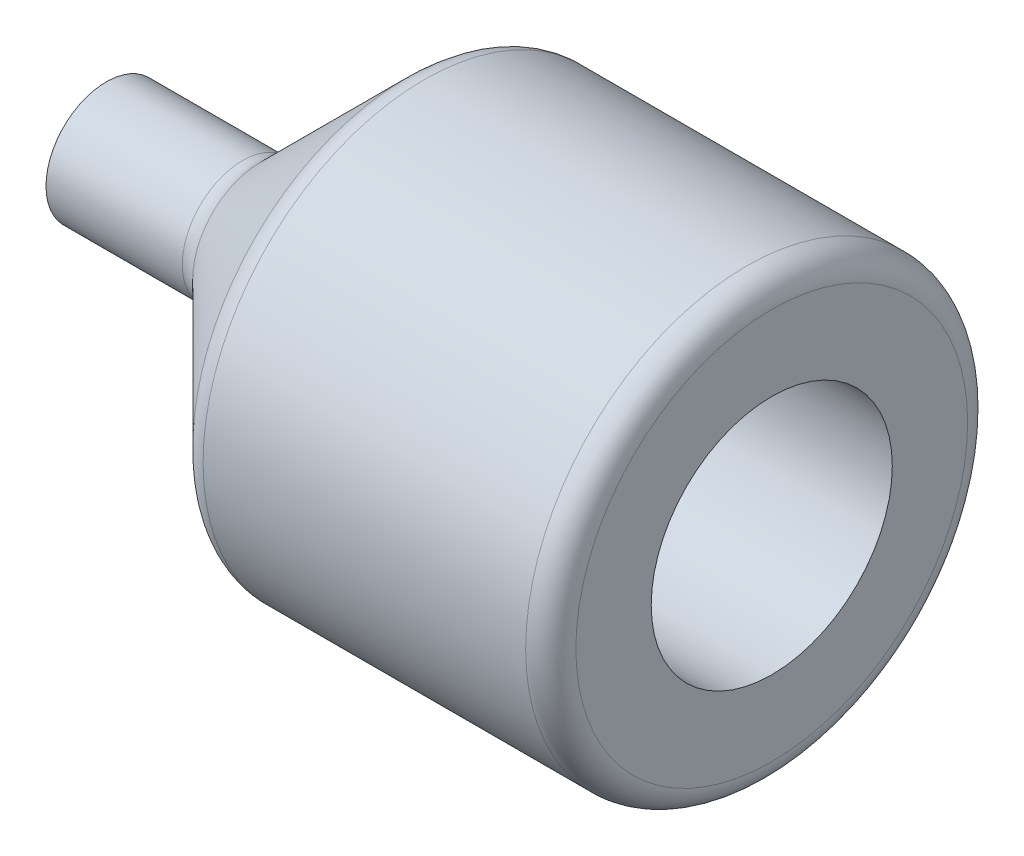
ISO-10303-21;
HEADER;
FILE_DESCRIPTION(('STEP AP214'),'2;1');
FILE_NAME('part.step','',(''),(''),'','','');
FILE_SCHEMA(('AUTOMOTIVE_DESIGN { 1 0 10303 214 1 1 1 1 }'));
ENDSEC;
DATA;
#1=APPLICATION_CONTEXT('core data for automotive mechanical design processes');
#2=APPLICATION_PROTOCOL_DEFINITION('international standard','automotive_design',2000,#1);
#3=PRODUCT_CONTEXT('',#1,'mechanical');
#4=PRODUCT('Part','Part','',(#3));
#5=PRODUCT_RELATED_PRODUCT_CATEGORY('part','',(#4));
#6=PRODUCT_DEFINITION_FORMATION('','',#4);
#7=PRODUCT_DEFINITION_CONTEXT('part definition',#1,'design');
#8=PRODUCT_DEFINITION('design','',#6,#7);
#9=PRODUCT_DEFINITION_SHAPE('','',#8);
#10=(LENGTH_UNIT() NAMED_UNIT(*) SI_UNIT(.MILLI.,.METRE.));
#11=(NAMED_UNIT(*) PLANE_ANGLE_UNIT() SI_UNIT($,.RADIAN.));
#12=(NAMED_UNIT(*) SI_UNIT($,.STERADIAN.) SOLID_ANGLE_UNIT());
#13=UNCERTAINTY_MEASURE_WITH_UNIT(LENGTH_MEASURE(1.E-05),#10,'distance_accuracy_value','');
#14=(GEOMETRIC_REPRESENTATION_CONTEXT(3) GLOBAL_UNCERTAINTY_ASSIGNED_CONTEXT((#13)) GLOBAL_UNIT_ASSIGNED_CONTEXT((#10,
#11,#12)) REPRESENTATION_CONTEXT('',''));
#15=CARTESIAN_POINT('',(0.,0.,0.));
#16=DIRECTION('',(0.,0.,1.));
#17=DIRECTION('',(1.,0.,0.));
#18=AXIS2_PLACEMENT_3D('',#15,#16,#17);
#19=CARTESIAN_POINT('',(-96.0720000000002,102.821,84.2789999999996));
#20=DIRECTION('',(-1.,0.,0.));
#21=DIRECTION('',(0.,0.,1.));
#22=AXIS2_PLACEMENT_3D('',#19,#20,#21);
#23=CYLINDRICAL_SURFACE('',#22,2.3999999999996);
#24=CARTESIAN_POINT('',(-109.644792206136,102.821,84.2789999999996));
#25=DIRECTION('',(-1.,0.,0.));
#26=DIRECTION('',(0.,0.,1.));
#27=AXIS2_PLACEMENT_3D('',#24,#25,#26);
#28=CIRCLE('',#27,2.3999999999996);
#29=CARTESIAN_POINT('',(-109.644792206136,102.821,86.6789999999992));
#30=VERTEX_POINT('',#29);
#31=EDGE_CURVE('E59',#30,#30,#28,.T.);
#32=ORIENTED_EDGE('',*,*,#31,.T.);
#33=EDGE_LOOP('',(#32));
#34=FACE_BOUND('',#33,.T.);
#35=CARTESIAN_POINT('',(-115.072,102.821,84.2789999999996));
#36=DIRECTION('',(-1.,0.,0.));
#37=DIRECTION('',(0.,0.,1.));
#38=AXIS2_PLACEMENT_3D('',#35,#36,#37);
#39=CIRCLE('',#38,2.3999999999996);
#40=CARTESIAN_POINT('',(-115.072,102.821,86.6789999999992));
#41=VERTEX_POINT('',#40);
#42=EDGE_CURVE('E55',#41,#41,#39,.T.);
#43=ORIENTED_EDGE('',*,*,#42,.F.);
#44=EDGE_LOOP('',(#43));
#45=FACE_BOUND('',#44,.T.);
#46=ADVANCED_FACE('F35',(#34,#45),#23,.T.);
#47=CARTESIAN_POINT('',(-115.072,0.,84.279));
#48=DIRECTION('',(-1.,0.,0.));
#49=DIRECTION('',(0.,0.,1.));
#50=AXIS2_PLACEMENT_3D('',#47,#48,#49);
#51=PLANE('',#50);
#52=ORIENTED_EDGE('',*,*,#42,.T.);
#53=EDGE_LOOP('',(#52));
#54=FACE_BOUND('',#53,.T.);
#55=ADVANCED_FACE('F49',(#54),#51,.T.);
#56=CARTESIAN_POINT('',(-96.2719999999958,102.821,84.2789999999996));
#57=DIRECTION('',(1.,0.,0.));
#58=DIRECTION('',(0.,0.,-1.));
#59=AXIS2_PLACEMENT_3D('',#56,#57,#58);
#60=CONICAL_SURFACE('',#59,4.79999999999961,0.785398163396911);
#61=CARTESIAN_POINT('',(-101.072,102.821,84.279));
#62=VERTEX_POINT('',#61);
#63=VERTEX_LOOP('',#62);
#64=FACE_BOUND('',#63,.T.);
#65=CARTESIAN_POINT('',(-96.2719999999958,102.821,84.2789999999996));
#66=DIRECTION('',(-1.,0.,0.));
#67=DIRECTION('',(0.,0.,1.));
#68=AXIS2_PLACEMENT_3D('',#65,#66,#67);
#69=CIRCLE('',#68,4.79999999999961);
#70=CARTESIAN_POINT('',(-96.2719999999958,102.821,89.0789999999993));
#71=VERTEX_POINT('',#70);
#72=EDGE_CURVE('E53',#71,#71,#69,.T.);
#73=ORIENTED_EDGE('',*,*,#72,.F.);
#74=EDGE_LOOP('',(#73));
#75=FACE_BOUND('',#74,.T.);
#76=ADVANCED_FACE('F45',(#64,#75),#60,.F.);
#77=CARTESIAN_POINT('',(-96.0720000000002,102.821,84.2789999999996));
#78=DIRECTION('',(-1.,0.,0.));
#79=DIRECTION('',(0.,0.,1.));
#80=AXIS2_PLACEMENT_3D('',#77,#78,#79);
#81=CYLINDRICAL_SURFACE('',#80,4.79999999999962);
#82=ORIENTED_EDGE('',*,*,#72,.T.);
#83=EDGE_LOOP('',(#82));
#84=FACE_BOUND('',#83,.T.);
#85=CARTESIAN_POINT('',(-88.572,102.821,84.2789999999996));
#86=DIRECTION('',(-1.,0.,0.));
#87=DIRECTION('',(0.,0.,1.));
#88=AXIS2_PLACEMENT_3D('',#85,#86,#87);
#89=CIRCLE('',#88,4.79999999999962);
#90=CARTESIAN_POINT('',(-88.572,102.821,89.0789999999993));
#91=VERTEX_POINT('',#90);
#92=EDGE_CURVE('E56',#91,#91,#89,.T.);
#93=ORIENTED_EDGE('',*,*,#92,.F.);
#94=EDGE_LOOP('',(#93));
#95=FACE_BOUND('',#94,.T.);
#96=ADVANCED_FACE('F48',(#84,#95),#81,.F.);
#97=CARTESIAN_POINT('',(-88.572,0.,84.279));
#98=DIRECTION('',(1.,0.,0.));
#99=DIRECTION('',(0.,0.,-1.));
#100=AXIS2_PLACEMENT_3D('',#97,#98,#99);
#101=PLANE('',#100);
#102=CARTESIAN_POINT('',(-88.572,102.821,84.2789999999996));
#103=DIRECTION('',(1.,0.,0.));
#104=DIRECTION('',(0.,0.,-1.));
#105=AXIS2_PLACEMENT_3D('',#102,#103,#104);
#106=CIRCLE('',#105,7.79999999999961);
#107=CARTESIAN_POINT('',(-88.572,102.821,76.479));
#108=VERTEX_POINT('',#107);
#109=EDGE_CURVE('E11',#108,#108,#106,.T.);
#110=ORIENTED_EDGE('',*,*,#109,.T.);
#111=EDGE_LOOP('',(#110));
#112=FACE_BOUND('',#111,.T.);
#113=ORIENTED_EDGE('',*,*,#92,.T.);
#114=EDGE_LOOP('',(#113));
#115=FACE_BOUND('',#114,.T.);
#116=ADVANCED_FACE('F105',(#112,#115),#101,.T.);
#117=CARTESIAN_POINT('',(-96.0720000000002,102.821,84.2789999999996));
#118=DIRECTION('',(-1.,0.,0.));
#119=DIRECTION('',(0.,0.,1.));
#120=AXIS2_PLACEMENT_3D('',#117,#118,#119);
#121=CYLINDRICAL_SURFACE('',#120,8.79999999999961);
#122=CARTESIAN_POINT('',(-89.572,102.821,84.2789999999996));
#123=DIRECTION('',(1.,0.,0.));
#124=DIRECTION('',(0.,0.,-1.));
#125=AXIS2_PLACEMENT_3D('',#122,#123,#124);
#126=CIRCLE('',#125,8.79999999999961);
#127=CARTESIAN_POINT('',(-89.572,102.821,75.479));
#128=VERTEX_POINT('',#127);
#129=EDGE_CURVE('E42',#128,#128,#126,.F.);
#130=ORIENTED_EDGE('',*,*,#129,.T.);
#131=EDGE_LOOP('',(#130));
#132=FACE_BOUND('',#131,.T.);
#133=CARTESIAN_POINT('',(-102.416365081384,102.821,84.2789999999996));
#134=DIRECTION('',(1.,0.,0.));
#135=DIRECTION('',(0.,0.,-1.));
#136=AXIS2_PLACEMENT_3D('',#133,#134,#135);
#137=CIRCLE('',#136,8.79999999999961);
#138=CARTESIAN_POINT('',(-102.416365081384,102.821,75.479));
#139=VERTEX_POINT('',#138);
#140=EDGE_CURVE('E72',#139,#139,#137,.T.);
#141=ORIENTED_EDGE('',*,*,#140,.T.);
#142=EDGE_LOOP('',(#141));
#143=FACE_BOUND('',#142,.T.);
#144=ADVANCED_FACE('F77',(#132,#143),#121,.T.);
#145=CARTESIAN_POINT('',(-109.230578643763,102.821,84.2789999999996));
#146=DIRECTION('',(1.,0.,0.));
#147=DIRECTION('',(0.,0.,-1.));
#148=AXIS2_PLACEMENT_3D('',#145,#146,#147);
#149=CONICAL_SURFACE('',#148,2.3999999999996,0.785398163397004);
#150=CARTESIAN_POINT('',(-108.937685424949,102.821,84.2789999999996));
#151=DIRECTION('',(1.,0.,0.));
#152=DIRECTION('',(0.,0.,-1.));
#153=AXIS2_PLACEMENT_3D('',#150,#151,#152);
#154=CIRCLE('',#153,2.69289321881273);
#155=CARTESIAN_POINT('',(-108.937685424949,102.821,81.5861067811869));
#156=VERTEX_POINT('',#155);
#157=EDGE_CURVE('E69',#156,#156,#154,.T.);
#158=CARTESIAN_POINT('',(-103.12347186257,102.821,84.2789999999996));
#159=DIRECTION('',(-1.,0.,0.));
#160=DIRECTION('',(0.,0.,1.));
#161=AXIS2_PLACEMENT_3D('',#158,#159,#160);
#162=CIRCLE('',#161,8.50710678118648);
#163=CARTESIAN_POINT('',(-103.12347186257,102.821,75.7718932188132));
#164=VERTEX_POINT('',#163);
#165=EDGE_CURVE('E66',#164,#164,#162,.T.);
#166=CARTESIAN_POINT('',(-108.937685424949,102.821,81.5861067811869));
#167=CARTESIAN_POINT('',(-108.877120700341,102.821,81.5255420565789));
#168=CARTESIAN_POINT('',(-108.816555975733,102.821,81.4649773319708));
#169=CARTESIAN_POINT('',(-108.695426526517,102.821,81.3438478827547));
#170=CARTESIAN_POINT('',(-108.634861801909,102.821,81.2832831581466));
#171=CARTESIAN_POINT('',(-108.513732352693,102.821,81.1621537089305));
#172=CARTESIAN_POINT('',(-108.453167628084,102.821,81.1015889843224));
#173=CARTESIAN_POINT('',(-108.332038178868,102.821,80.9804595351063));
#174=CARTESIAN_POINT('',(-108.27147345426,102.821,80.9198948104983));
#175=CARTESIAN_POINT('',(-108.150344005044,102.821,80.7987653612821));
#176=CARTESIAN_POINT('',(-108.089779280436,102.821,80.7382006366741));
#177=CARTESIAN_POINT('',(-107.96864983122,102.821,80.617071187458));
#178=CARTESIAN_POINT('',(-107.908085106611,102.821,80.5565064628499));
#179=CARTESIAN_POINT('',(-107.786955657395,102.821,80.4353770136338));
#180=CARTESIAN_POINT('',(-107.726390932787,102.821,80.3748122890257));
#181=CARTESIAN_POINT('',(-107.605261483571,102.821,80.2536828398096));
#182=CARTESIAN_POINT('',(-107.544696758963,102.821,80.1931181152015));
#183=CARTESIAN_POINT('',(-107.423567309747,102.821,80.0719886659854));
#184=CARTESIAN_POINT('',(-107.363002585138,102.821,80.0114239413774));
#185=CARTESIAN_POINT('',(-107.241873135922,102.821,79.8902944921612));
#186=CARTESIAN_POINT('',(-107.181308411314,102.821,79.8297297675532));
#187=CARTESIAN_POINT('',(-107.060178962098,102.821,79.7086003183371));
#188=CARTESIAN_POINT('',(-106.99961423749,102.821,79.648035593729));
#189=CARTESIAN_POINT('',(-106.878484788273,102.821,79.5269061445129));
#190=CARTESIAN_POINT('',(-106.817920063665,102.821,79.4663414199048));
#191=CARTESIAN_POINT('',(-106.696790614449,102.821,79.3452119706887));
#192=CARTESIAN_POINT('',(-106.636225889841,102.821,79.2846472460806));
#193=CARTESIAN_POINT('',(-106.515096440625,102.821,79.1635177968645));
#194=CARTESIAN_POINT('',(-106.454531716017,102.821,79.1029530722565));
#195=CARTESIAN_POINT('',(-106.3334022668,102.821,78.9818236230403));
#196=CARTESIAN_POINT('',(-106.272837542192,102.821,78.9212588984323));
#197=CARTESIAN_POINT('',(-106.151708092976,102.821,78.8001294492162));
#198=CARTESIAN_POINT('',(-106.091143368368,102.821,78.7395647246081));
#199=CARTESIAN_POINT('',(-105.970013919152,102.821,78.618435275392));
#200=CARTESIAN_POINT('',(-105.909449194544,102.821,78.5578705507839));
#201=CARTESIAN_POINT('',(-105.788319745327,102.821,78.4367411015678));
#202=CARTESIAN_POINT('',(-105.727755020719,102.821,78.3761763769597));
#203=CARTESIAN_POINT('',(-105.606625571503,102.821,78.2550469277436));
#204=CARTESIAN_POINT('',(-105.546060846895,102.821,78.1944822031356));
#205=CARTESIAN_POINT('',(-105.424931397679,102.821,78.0733527539194));
#206=CARTESIAN_POINT('',(-105.364366673071,102.821,78.0127880293114));
#207=CARTESIAN_POINT('',(-105.243237223854,102.821,77.8916585800953));
#208=CARTESIAN_POINT('',(-105.182672499246,102.821,77.8310938554872));
#209=CARTESIAN_POINT('',(-105.06154305003,102.821,77.7099644062711));
#210=CARTESIAN_POINT('',(-105.000978325422,102.821,77.649399681663));
#211=CARTESIAN_POINT('',(-104.879848876206,102.821,77.5282702324469));
#212=CARTESIAN_POINT('',(-104.819284151598,102.821,77.4677055078388));
#213=CARTESIAN_POINT('',(-104.698154702381,102.821,77.3465760586227));
#214=CARTESIAN_POINT('',(-104.637589977773,102.821,77.2860113340147));
#215=CARTESIAN_POINT('',(-104.516460528557,102.821,77.1648818847985));
#216=CARTESIAN_POINT('',(-104.455895803949,102.821,77.1043171601905));
#217=CARTESIAN_POINT('',(-104.334766354733,102.821,76.9831877109744));
#218=CARTESIAN_POINT('',(-104.274201630125,102.821,76.9226229863663));
#219=CARTESIAN_POINT('',(-104.153072180908,102.821,76.8014935371502));
#220=CARTESIAN_POINT('',(-104.0925074563,102.821,76.7409288125421));
#221=CARTESIAN_POINT('',(-103.971378007084,102.821,76.619799363326));
#222=CARTESIAN_POINT('',(-103.910813282476,102.821,76.5592346387179));
#223=CARTESIAN_POINT('',(-103.78968383326,102.821,76.4381051895018));
#224=CARTESIAN_POINT('',(-103.729119108652,102.821,76.3775404648938));
#225=CARTESIAN_POINT('',(-103.607989659435,102.821,76.2564110156777));
#226=CARTESIAN_POINT('',(-103.547424934827,102.821,76.1958462910696));
#227=CARTESIAN_POINT('',(-103.426295485611,102.821,76.0747168418535));
#228=CARTESIAN_POINT('',(-103.365730761003,102.821,76.0141521172454));
#229=CARTESIAN_POINT('',(-103.244601311787,102.821,75.8930226680293));
#230=CARTESIAN_POINT('',(-103.184036587179,102.821,75.8324579434212));
#231=CARTESIAN_POINT('',(-103.12347186257,102.821,75.7718932188132));
#232=B_SPLINE_CURVE_WITH_KNOTS('',3,(#166,#167,#168,#169,#170,#171,#172,#173,#174,#175,#176,
#177,#178,#179,#180,#181,#182,#183,#184,#185,#186,#187,#188,#189,#190,#191,#192,#193,#194,#195,
#196,#197,#198,#199,#200,#201,#202,#203,#204,#205,#206,#207,#208,#209,#210,#211,#212,#213,#214,
#215,#216,#217,#218,#219,#220,#221,#222,#223,#224,#225,#226,#227,#228,#229,#230,#231),
.UNSPECIFIED.,.F.,.F.,(4,2,2,2,2,2,2,2,2,2,2,2,2,2,2,2,2,2,2,2,2,2,2,2,2,2,2,2,2,2,2,2,4),(0.,
0.256954364826438,0.513908729652887,0.770863094479325,1.02781745930577,1.28477182413221,
1.54172618895865,1.7986805537851,2.05563491861154,2.31258928343798,2.56954364826442,
2.82649801309088,3.08345237791732,3.34040674274377,3.59736110757021,3.85431547239665,
4.11126983722309,4.36822420204953,4.62517856687598,4.88213293170242,5.13908729652887,
5.3960416613553,5.65299602618176,5.9099503910082,6.16690475583465,6.42385912066109,
6.68081348548753,6.93776785031397,7.19472221514041,7.45167657996686,7.7086309447933,
7.96558530961975,8.22253967444618),.UNSPECIFIED.);
#233=EDGE_CURVE('BSEAM89',#156,#164,#232,.T.);
#234=ORIENTED_EDGE('',*,*,#157,.T.);
#235=ORIENTED_EDGE('',*,*,#165,.T.);
#236=ORIENTED_EDGE('',*,*,#233,.T.);
#237=ORIENTED_EDGE('',*,*,#233,.F.);
#238=EDGE_LOOP('',(#234,#236,#235,#237));
#239=FACE_BOUND('',#238,.T.);
#240=ADVANCED_FACE('F89',(#239),#149,.T.);
#241=CARTESIAN_POINT('',(-109.644792206136,102.821,84.2789999999996));
#242=DIRECTION('',(-1.,0.,0.));
#243=DIRECTION('',(0.,0.,1.));
#244=AXIS2_PLACEMENT_3D('',#241,#242,#243);
#245=TOROIDAL_SURFACE('',#244,3.3999999999996,1.);
#246=ORIENTED_EDGE('',*,*,#157,.F.);
#247=EDGE_LOOP('',(#246));
#248=FACE_BOUND('',#247,.T.);
#249=ORIENTED_EDGE('',*,*,#31,.F.);
#250=EDGE_LOOP('',(#249));
#251=FACE_BOUND('',#250,.T.);
#252=ADVANCED_FACE('F82',(#248,#251),#245,.F.);
#253=CARTESIAN_POINT('',(-89.572,102.821,84.2789999999996));
#254=DIRECTION('',(1.,0.,0.));
#255=DIRECTION('',(0.,0.,-1.));
#256=AXIS2_PLACEMENT_3D('',#253,#254,#255);
#257=TOROIDAL_SURFACE('',#256,7.79999999999961,1.);
#258=ORIENTED_EDGE('',*,*,#109,.F.);
#259=EDGE_LOOP('',(#258));
#260=FACE_BOUND('',#259,.T.);
#261=ORIENTED_EDGE('',*,*,#129,.F.);
#262=EDGE_LOOP('',(#261));
#263=FACE_BOUND('',#262,.T.);
#264=ADVANCED_FACE('F80',(#260,#263),#257,.T.);
#265=CARTESIAN_POINT('',(-102.416365081384,102.821,84.2789999999996));
#266=DIRECTION('',(1.,0.,0.));
#267=DIRECTION('',(0.,0.,-1.));
#268=AXIS2_PLACEMENT_3D('',#265,#266,#267);
#269=TOROIDAL_SURFACE('',#268,7.79999999999961,1.);
#270=ORIENTED_EDGE('',*,*,#140,.F.);
#271=EDGE_LOOP('',(#270));
#272=FACE_BOUND('',#271,.T.);
#273=ORIENTED_EDGE('',*,*,#165,.F.);
#274=EDGE_LOOP('',(#273));
#275=FACE_BOUND('',#274,.T.);
#276=ADVANCED_FACE('F37',(#272,#275),#269,.T.);
#277=CLOSED_SHELL('',(#46,#55,#76,#96,#116,#144,#240,#252,#264,#276));
#278=MANIFOLD_SOLID_BREP('B2',#277);
#279=ADVANCED_BREP_SHAPE_REPRESENTATION('',(#18,#278),#14);
#280=SHAPE_DEFINITION_REPRESENTATION(#9,#279);
ENDSEC;
END-ISO-10303-21;
